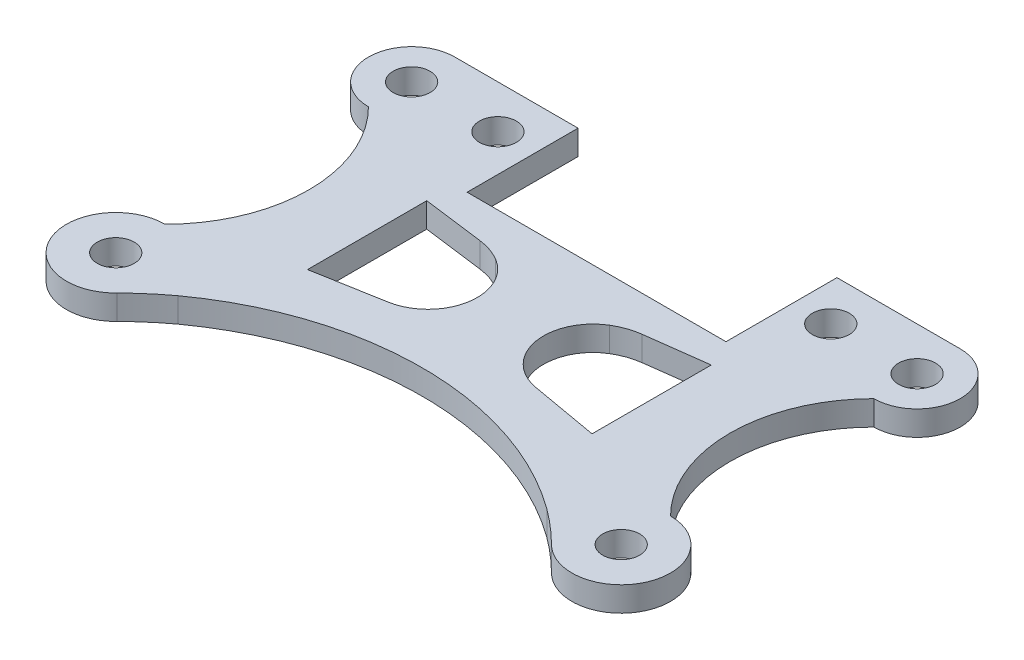
ISO-10303-21;
HEADER;
FILE_DESCRIPTION(('STEP AP214'),'2;1');
FILE_NAME('part.step','',(''),(''),'','','');
FILE_SCHEMA(('AUTOMOTIVE_DESIGN { 1 0 10303 214 1 1 1 1 }'));
ENDSEC;
DATA;
#1=APPLICATION_CONTEXT('core data for automotive mechanical design processes');
#2=APPLICATION_PROTOCOL_DEFINITION('international standard','automotive_design',2000,#1);
#3=PRODUCT_CONTEXT('',#1,'mechanical');
#4=PRODUCT('Part','Part','',(#3));
#5=PRODUCT_RELATED_PRODUCT_CATEGORY('part','',(#4));
#6=PRODUCT_DEFINITION_FORMATION('','',#4);
#7=PRODUCT_DEFINITION_CONTEXT('part definition',#1,'design');
#8=PRODUCT_DEFINITION('design','',#6,#7);
#9=PRODUCT_DEFINITION_SHAPE('','',#8);
#10=(LENGTH_UNIT() NAMED_UNIT(*) SI_UNIT(.MILLI.,.METRE.));
#11=(NAMED_UNIT(*) PLANE_ANGLE_UNIT() SI_UNIT($,.RADIAN.));
#12=(NAMED_UNIT(*) SI_UNIT($,.STERADIAN.) SOLID_ANGLE_UNIT());
#13=UNCERTAINTY_MEASURE_WITH_UNIT(LENGTH_MEASURE(1.E-05),#10,'distance_accuracy_value','');
#14=(GEOMETRIC_REPRESENTATION_CONTEXT(3) GLOBAL_UNCERTAINTY_ASSIGNED_CONTEXT((#13)) GLOBAL_UNIT_ASSIGNED_CONTEXT((#10,
#11,#12)) REPRESENTATION_CONTEXT('',''));
#15=CARTESIAN_POINT('',(0.,0.,0.));
#16=DIRECTION('',(0.,0.,1.));
#17=DIRECTION('',(1.,0.,0.));
#18=AXIS2_PLACEMENT_3D('',#15,#16,#17);
#19=CARTESIAN_POINT('',(0.,2.,0.));
#20=DIRECTION('',(0.,1.,0.));
#21=DIRECTION('',(0.,0.,1.));
#22=AXIS2_PLACEMENT_3D('',#19,#20,#21);
#23=PLANE('',#22);
#24=DIRECTION('',(0.,0.,-1.));
#25=VECTOR('',#24,1.);
#26=CARTESIAN_POINT('',(11.5396831908717,2.,2.59231264166946));
#27=LINE('',#26,#25);
#28=CARTESIAN_POINT('',(11.5396831908717,2.,6.90495336701713));
#29=VERTEX_POINT('',#28);
#30=CARTESIAN_POINT('',(11.5396831908717,2.,-2.76479575934835));
#31=VERTEX_POINT('',#30);
#32=EDGE_CURVE('E235',#29,#31,#27,.T.);
#33=ORIENTED_EDGE('',*,*,#32,.F.);
#34=DIRECTION('',(0.984711899791406,0.,0.174190913681512));
#35=VECTOR('',#34,1.);
#36=CARTESIAN_POINT('',(11.5396831908717,2.,6.90495336701713));
#37=LINE('',#36,#35);
#38=CARTESIAN_POINT('',(5.99237736878853,2.,5.92366100137787));
#39=VERTEX_POINT('',#38);
#40=EDGE_CURVE('E232',#39,#29,#37,.T.);
#41=ORIENTED_EDGE('',*,*,#40,.F.);
#42=CARTESIAN_POINT('',(6.68914102351458,2.,1.98481340221225));
#43=DIRECTION('',(0.,1.,0.));
#44=DIRECTION('',(0.,0.,1.));
#45=AXIS2_PLACEMENT_3D('',#42,#43,#44);
#46=CIRCLE('',#45,4.);
#47=CARTESIAN_POINT('',(4.61826863287689,2.,-1.43739166786969));
#48=VERTEX_POINT('',#47);
#49=EDGE_CURVE('E466',#39,#48,#46,.F.);
#50=ORIENTED_EDGE('',*,*,#49,.T.);
#51=CARTESIAN_POINT('',(7.206859121174,2.,2.84036466973273));
#52=DIRECTION('',(0.,1.,0.));
#53=DIRECTION('',(0.,0.,1.));
#54=AXIS2_PLACEMENT_3D('',#51,#52,#53);
#55=CIRCLE('',#54,5.);
#56=CARTESIAN_POINT('',(6.56245899551597,2.,-2.11793629713605));
#57=VERTEX_POINT('',#56);
#58=EDGE_CURVE('E452',#48,#57,#55,.F.);
#59=ORIENTED_EDGE('',*,*,#58,.T.);
#60=DIRECTION('',(-0.991660193373757,0.,0.128880025131607));
#61=VECTOR('',#60,1.);
#62=CARTESIAN_POINT('',(11.5396831908717,2.,-2.76479575934835));
#63=LINE('',#62,#61);
#64=EDGE_CURVE('E227',#31,#57,#63,.T.);
#65=ORIENTED_EDGE('',*,*,#64,.F.);
#66=EDGE_LOOP('',(#33,#41,#50,#59,#65));
#67=FACE_BOUND('',#66,.T.);
#68=CARTESIAN_POINT('',(0.,2.,34.6584329453217));
#69=DIRECTION('',(0.,1.,0.));
#70=DIRECTION('',(0.,0.,-1.));
#71=AXIS2_PLACEMENT_3D('',#68,#69,#70);
#72=CIRCLE('',#71,25.5094306586074);
#73=CARTESIAN_POINT('',(14.965299889075,2.,14.));
#74=VERTEX_POINT('',#73);
#75=CARTESIAN_POINT('',(-14.965299889075,2.,14.));
#76=VERTEX_POINT('',#75);
#77=EDGE_CURVE('E243',#74,#76,#72,.T.);
#78=ORIENTED_EDGE('',*,*,#77,.F.);
#79=CARTESIAN_POINT('',(0.,2.,34.1457513110777));
#80=DIRECTION('',(0.,1.,0.));
#81=DIRECTION('',(0.,0.,1.));
#82=AXIS2_PLACEMENT_3D('',#79,#80,#81);
#83=CIRCLE('',#82,25.0960454386291);
#84=CARTESIAN_POINT('',(17.6121605698455,2.,16.2677397684112));
#85=VERTEX_POINT('',#84);
#86=EDGE_CURVE('E251',#74,#85,#83,.F.);
#87=ORIENTED_EDGE('',*,*,#86,.T.);
#88=CARTESIAN_POINT('',(20.5,2.,13.5));
#89=DIRECTION('',(0.,1.,0.));
#90=DIRECTION('',(0.,0.,1.));
#91=AXIS2_PLACEMENT_3D('',#88,#89,#90);
#92=CIRCLE('',#91,4.);
#93=CARTESIAN_POINT('',(20.5,2.,9.50000000000001));
#94=VERTEX_POINT('',#93);
#95=EDGE_CURVE('E321',#85,#94,#92,.T.);
#96=ORIENTED_EDGE('',*,*,#95,.T.);
#97=CARTESIAN_POINT('',(28.75,2.,1.25));
#98=DIRECTION('',(0.,1.,0.));
#99=DIRECTION('',(0.,0.,-1.));
#100=AXIS2_PLACEMENT_3D('',#97,#98,#99);
#101=CIRCLE('',#100,11.6672618895781);
#102=CARTESIAN_POINT('',(20.5,2.,-7.));
#103=VERTEX_POINT('',#102);
#104=EDGE_CURVE('E308',#103,#94,#101,.T.);
#105=ORIENTED_EDGE('',*,*,#104,.F.);
#106=CARTESIAN_POINT('',(20.5,2.,-10.5));
#107=DIRECTION('',(0.,1.,0.));
#108=DIRECTION('',(0.,0.,1.));
#109=AXIS2_PLACEMENT_3D('',#106,#107,#108);
#110=CIRCLE('',#109,3.5);
#111=CARTESIAN_POINT('',(20.5,2.,-14.));
#112=VERTEX_POINT('',#111);
#113=EDGE_CURVE('E371',#103,#112,#110,.T.);
#114=ORIENTED_EDGE('',*,*,#113,.T.);
#115=DIRECTION('',(1.,0.,0.));
#116=VECTOR('',#115,1.);
#117=CARTESIAN_POINT('',(0.,2.,-14.));
#118=LINE('',#117,#116);
#119=CARTESIAN_POINT('',(10.5,2.,-14.));
#120=VERTEX_POINT('',#119);
#121=EDGE_CURVE('E374',#120,#112,#118,.T.);
#122=ORIENTED_EDGE('',*,*,#121,.F.);
#123=DIRECTION('',(0.,0.,1.));
#124=VECTOR('',#123,1.);
#125=CARTESIAN_POINT('',(10.5,2.,0.));
#126=LINE('',#125,#124);
#127=CARTESIAN_POINT('',(10.5,2.,-5.));
#128=VERTEX_POINT('',#127);
#129=EDGE_CURVE('E378',#120,#128,#126,.T.);
#130=ORIENTED_EDGE('',*,*,#129,.T.);
#131=DIRECTION('',(-1.,0.,0.));
#132=VECTOR('',#131,1.);
#133=CARTESIAN_POINT('',(0.,2.,-5.));
#134=LINE('',#133,#132);
#135=CARTESIAN_POINT('',(-10.5,2.,-4.99999999999999));
#136=VERTEX_POINT('',#135);
#137=EDGE_CURVE('E382',#128,#136,#134,.T.);
#138=ORIENTED_EDGE('',*,*,#137,.T.);
#139=DIRECTION('',(0.,0.,-1.));
#140=VECTOR('',#139,1.);
#141=CARTESIAN_POINT('',(-10.5,2.,0.));
#142=LINE('',#141,#140);
#143=CARTESIAN_POINT('',(-10.5,2.,-14.));
#144=VERTEX_POINT('',#143);
#145=EDGE_CURVE('E385',#136,#144,#142,.T.);
#146=ORIENTED_EDGE('',*,*,#145,.T.);
#147=CARTESIAN_POINT('',(-20.5,2.,-14.));
#148=VERTEX_POINT('',#147);
#149=EDGE_CURVE('E379',#148,#144,#118,.T.);
#150=ORIENTED_EDGE('',*,*,#149,.F.);
#151=CARTESIAN_POINT('',(-20.5,2.,-10.5));
#152=DIRECTION('',(0.,1.,0.));
#153=DIRECTION('',(0.,0.,1.));
#154=AXIS2_PLACEMENT_3D('',#151,#152,#153);
#155=CIRCLE('',#154,3.5);
#156=CARTESIAN_POINT('',(-20.5,2.,-7.));
#157=VERTEX_POINT('',#156);
#158=EDGE_CURVE('E347',#148,#157,#155,.T.);
#159=ORIENTED_EDGE('',*,*,#158,.T.);
#160=CARTESIAN_POINT('',(-28.75,2.,1.25));
#161=DIRECTION('',(0.,-1.,0.));
#162=DIRECTION('',(0.,0.,-1.));
#163=AXIS2_PLACEMENT_3D('',#160,#161,#162);
#164=CIRCLE('',#163,11.6672618895781);
#165=CARTESIAN_POINT('',(-20.5,2.,9.50000000000001));
#166=VERTEX_POINT('',#165);
#167=EDGE_CURVE('E279',#157,#166,#164,.T.);
#168=ORIENTED_EDGE('',*,*,#167,.T.);
#169=CARTESIAN_POINT('',(-20.5,2.,13.5));
#170=DIRECTION('',(0.,-1.,0.));
#171=DIRECTION('',(0.,0.,1.));
#172=AXIS2_PLACEMENT_3D('',#169,#170,#171);
#173=CIRCLE('',#172,4.);
#174=CARTESIAN_POINT('',(-17.6121605698453,2.,16.2677397684109));
#175=VERTEX_POINT('',#174);
#176=EDGE_CURVE('E295',#175,#166,#173,.T.);
#177=ORIENTED_EDGE('',*,*,#176,.F.);
#178=CARTESIAN_POINT('',(0.,2.,34.1457513110777));
#179=DIRECTION('',(0.,1.,0.));
#180=DIRECTION('',(0.,0.,1.));
#181=AXIS2_PLACEMENT_3D('',#178,#179,#180);
#182=CIRCLE('',#181,25.0960454386291);
#183=EDGE_CURVE('E264',#175,#76,#182,.F.);
#184=ORIENTED_EDGE('',*,*,#183,.T.);
#185=EDGE_LOOP('',(#78,#87,#96,#105,#114,#122,#130,#138,#146,#150,#159,#168,#177,#184));
#186=FACE_BOUND('',#185,.T.);
#187=CARTESIAN_POINT('',(-20.5,2.,13.5));
#188=DIRECTION('',(0.,-1.,0.));
#189=DIRECTION('',(0.,0.,1.));
#190=AXIS2_PLACEMENT_3D('',#187,#188,#189);
#191=CIRCLE('',#190,1.5);
#192=CARTESIAN_POINT('',(-20.5,2.,15.));
#193=VERTEX_POINT('',#192);
#194=EDGE_CURVE('E287',#193,#193,#191,.T.);
#195=ORIENTED_EDGE('',*,*,#194,.T.);
#196=EDGE_LOOP('',(#195));
#197=FACE_BOUND('',#196,.T.);
#198=CARTESIAN_POINT('',(20.5,2.,13.5));
#199=DIRECTION('',(0.,1.,0.));
#200=DIRECTION('',(0.,0.,1.));
#201=AXIS2_PLACEMENT_3D('',#198,#199,#200);
#202=CIRCLE('',#201,1.5);
#203=CARTESIAN_POINT('',(20.5,2.,15.));
#204=VERTEX_POINT('',#203);
#205=EDGE_CURVE('E313',#204,#204,#202,.T.);
#206=ORIENTED_EDGE('',*,*,#205,.F.);
#207=EDGE_LOOP('',(#206));
#208=FACE_BOUND('',#207,.T.);
#209=CARTESIAN_POINT('',(-13.5,2.,-10.5));
#210=DIRECTION('',(0.,1.,0.));
#211=DIRECTION('',(0.,0.,1.));
#212=AXIS2_PLACEMENT_3D('',#209,#210,#211);
#213=CIRCLE('',#212,1.5);
#214=CARTESIAN_POINT('',(-13.5,2.,-9.));
#215=VERTEX_POINT('',#214);
#216=EDGE_CURVE('E334',#215,#215,#213,.T.);
#217=ORIENTED_EDGE('',*,*,#216,.F.);
#218=EDGE_LOOP('',(#217));
#219=FACE_BOUND('',#218,.T.);
#220=CARTESIAN_POINT('',(-20.5,2.,-10.5));
#221=DIRECTION('',(0.,1.,0.));
#222=DIRECTION('',(0.,0.,1.));
#223=AXIS2_PLACEMENT_3D('',#220,#221,#222);
#224=CIRCLE('',#223,1.5);
#225=CARTESIAN_POINT('',(-20.5,2.,-9.));
#226=VERTEX_POINT('',#225);
#227=EDGE_CURVE('E339',#226,#226,#224,.T.);
#228=ORIENTED_EDGE('',*,*,#227,.F.);
#229=EDGE_LOOP('',(#228));
#230=FACE_BOUND('',#229,.T.);
#231=CARTESIAN_POINT('',(20.5,2.,-10.5));
#232=DIRECTION('',(0.,1.,0.));
#233=DIRECTION('',(0.,0.,1.));
#234=AXIS2_PLACEMENT_3D('',#231,#232,#233);
#235=CIRCLE('',#234,1.5);
#236=CARTESIAN_POINT('',(20.5,2.,-9.));
#237=VERTEX_POINT('',#236);
#238=EDGE_CURVE('E362',#237,#237,#235,.T.);
#239=ORIENTED_EDGE('',*,*,#238,.F.);
#240=EDGE_LOOP('',(#239));
#241=FACE_BOUND('',#240,.T.);
#242=CARTESIAN_POINT('',(13.5,2.,-10.5));
#243=DIRECTION('',(0.,1.,0.));
#244=DIRECTION('',(0.,0.,1.));
#245=AXIS2_PLACEMENT_3D('',#242,#243,#244);
#246=CIRCLE('',#245,1.5);
#247=CARTESIAN_POINT('',(13.5,2.,-9.));
#248=VERTEX_POINT('',#247);
#249=EDGE_CURVE('E366',#248,#248,#246,.T.);
#250=ORIENTED_EDGE('',*,*,#249,.F.);
#251=EDGE_LOOP('',(#250));
#252=FACE_BOUND('',#251,.T.);
#253=DIRECTION('',(0.,0.,-1.));
#254=VECTOR('',#253,1.);
#255=CARTESIAN_POINT('',(-11.5396831908717,2.,2.59231264166946));
#256=LINE('',#255,#254);
#257=CARTESIAN_POINT('',(-11.5396831908717,2.,6.90495336701713));
#258=VERTEX_POINT('',#257);
#259=CARTESIAN_POINT('',(-11.5396831908717,2.,-2.76479575934835));
#260=VERTEX_POINT('',#259);
#261=EDGE_CURVE('E205',#258,#260,#256,.T.);
#262=ORIENTED_EDGE('',*,*,#261,.T.);
#263=DIRECTION('',(0.991660193373757,0.,0.128880025131607));
#264=VECTOR('',#263,1.);
#265=CARTESIAN_POINT('',(-11.5396831908717,2.,-2.76479575934835));
#266=LINE('',#265,#264);
#267=CARTESIAN_POINT('',(-6.56245899551597,2.,-2.11793629713605));
#268=VERTEX_POINT('',#267);
#269=EDGE_CURVE('E207',#260,#268,#266,.T.);
#270=ORIENTED_EDGE('',*,*,#269,.T.);
#271=CARTESIAN_POINT('',(-7.206859121174,2.,2.84036466973273));
#272=DIRECTION('',(0.,1.,0.));
#273=DIRECTION('',(0.,0.,1.));
#274=AXIS2_PLACEMENT_3D('',#271,#272,#273);
#275=CIRCLE('',#274,5.);
#276=CARTESIAN_POINT('',(-4.61826863287689,2.,-1.43739166786969));
#277=VERTEX_POINT('',#276);
#278=EDGE_CURVE('E485',#268,#277,#275,.F.);
#279=ORIENTED_EDGE('',*,*,#278,.T.);
#280=CARTESIAN_POINT('',(-6.68914102351458,2.,1.98481340221225));
#281=DIRECTION('',(0.,1.,0.));
#282=DIRECTION('',(0.,0.,1.));
#283=AXIS2_PLACEMENT_3D('',#280,#281,#282);
#284=CIRCLE('',#283,4.);
#285=CARTESIAN_POINT('',(-5.99237736878853,2.,5.92366100137787));
#286=VERTEX_POINT('',#285);
#287=EDGE_CURVE('E52',#277,#286,#284,.F.);
#288=ORIENTED_EDGE('',*,*,#287,.T.);
#289=DIRECTION('',(-0.984711899791406,0.,0.174190913681512));
#290=VECTOR('',#289,1.);
#291=CARTESIAN_POINT('',(-11.5396831908717,2.,6.90495336701713));
#292=LINE('',#291,#290);
#293=EDGE_CURVE('E201',#286,#258,#292,.T.);
#294=ORIENTED_EDGE('',*,*,#293,.T.);
#295=EDGE_LOOP('',(#262,#270,#279,#288,#294));
#296=FACE_BOUND('',#295,.T.);
#297=ADVANCED_FACE('F43',(#67,#186,#197,#208,#219,#230,#241,#252,#296),#23,.T.);
#298=CARTESIAN_POINT('',(0.,0.,0.));
#299=DIRECTION('',(0.,1.,0.));
#300=DIRECTION('',(0.,0.,1.));
#301=AXIS2_PLACEMENT_3D('',#298,#299,#300);
#302=PLANE('',#301);
#303=CARTESIAN_POINT('',(-20.5,0.,13.5));
#304=DIRECTION('',(0.,-1.,0.));
#305=DIRECTION('',(0.,0.,1.));
#306=AXIS2_PLACEMENT_3D('',#303,#304,#305);
#307=CIRCLE('',#306,1.5);
#308=CARTESIAN_POINT('',(-20.5,0.,15.));
#309=VERTEX_POINT('',#308);
#310=EDGE_CURVE('E291',#309,#309,#307,.T.);
#311=ORIENTED_EDGE('',*,*,#310,.F.);
#312=EDGE_LOOP('',(#311));
#313=FACE_BOUND('',#312,.T.);
#314=CARTESIAN_POINT('',(20.5,0.,13.5));
#315=DIRECTION('',(0.,1.,0.));
#316=DIRECTION('',(0.,0.,1.));
#317=AXIS2_PLACEMENT_3D('',#314,#315,#316);
#318=CIRCLE('',#317,1.5);
#319=CARTESIAN_POINT('',(20.5,0.,15.));
#320=VERTEX_POINT('',#319);
#321=EDGE_CURVE('E317',#320,#320,#318,.T.);
#322=ORIENTED_EDGE('',*,*,#321,.T.);
#323=EDGE_LOOP('',(#322));
#324=FACE_BOUND('',#323,.T.);
#325=CARTESIAN_POINT('',(-13.5,0.,-10.5));
#326=DIRECTION('',(0.,1.,0.));
#327=DIRECTION('',(0.,0.,1.));
#328=AXIS2_PLACEMENT_3D('',#325,#326,#327);
#329=CIRCLE('',#328,1.5);
#330=CARTESIAN_POINT('',(-13.5,0.,-9.));
#331=VERTEX_POINT('',#330);
#332=EDGE_CURVE('E335',#331,#331,#329,.T.);
#333=ORIENTED_EDGE('',*,*,#332,.T.);
#334=EDGE_LOOP('',(#333));
#335=FACE_BOUND('',#334,.T.);
#336=CARTESIAN_POINT('',(-20.5,0.,-10.5));
#337=DIRECTION('',(0.,1.,0.));
#338=DIRECTION('',(0.,0.,1.));
#339=AXIS2_PLACEMENT_3D('',#336,#337,#338);
#340=CIRCLE('',#339,1.5);
#341=CARTESIAN_POINT('',(-20.5,0.,-9.));
#342=VERTEX_POINT('',#341);
#343=EDGE_CURVE('E343',#342,#342,#340,.T.);
#344=ORIENTED_EDGE('',*,*,#343,.T.);
#345=EDGE_LOOP('',(#344));
#346=FACE_BOUND('',#345,.T.);
#347=CARTESIAN_POINT('',(20.5,0.,-10.5));
#348=DIRECTION('',(0.,1.,0.));
#349=DIRECTION('',(0.,0.,1.));
#350=AXIS2_PLACEMENT_3D('',#347,#348,#349);
#351=CIRCLE('',#350,1.5);
#352=CARTESIAN_POINT('',(20.5,0.,-9.));
#353=VERTEX_POINT('',#352);
#354=EDGE_CURVE('E361',#353,#353,#351,.T.);
#355=ORIENTED_EDGE('',*,*,#354,.T.);
#356=EDGE_LOOP('',(#355));
#357=FACE_BOUND('',#356,.T.);
#358=CARTESIAN_POINT('',(13.5,0.,-10.5));
#359=DIRECTION('',(0.,1.,0.));
#360=DIRECTION('',(0.,0.,1.));
#361=AXIS2_PLACEMENT_3D('',#358,#359,#360);
#362=CIRCLE('',#361,1.5);
#363=CARTESIAN_POINT('',(13.5,0.,-9.));
#364=VERTEX_POINT('',#363);
#365=EDGE_CURVE('E391',#364,#364,#362,.T.);
#366=ORIENTED_EDGE('',*,*,#365,.T.);
#367=EDGE_LOOP('',(#366));
#368=FACE_BOUND('',#367,.T.);
#369=CARTESIAN_POINT('',(0.,0.,34.1457513110777));
#370=DIRECTION('',(0.,1.,0.));
#371=DIRECTION('',(0.,0.,1.));
#372=AXIS2_PLACEMENT_3D('',#369,#370,#371);
#373=CIRCLE('',#372,25.0960454386291);
#374=CARTESIAN_POINT('',(14.965299889075,0.,14.));
#375=VERTEX_POINT('',#374);
#376=CARTESIAN_POINT('',(17.6121605698455,0.,16.2677397684112));
#377=VERTEX_POINT('',#376);
#378=EDGE_CURVE('E254',#375,#377,#373,.F.);
#379=ORIENTED_EDGE('',*,*,#378,.F.);
#380=CARTESIAN_POINT('',(0.,0.,34.6584329453217));
#381=DIRECTION('',(0.,1.,0.));
#382=DIRECTION('',(0.,0.,-1.));
#383=AXIS2_PLACEMENT_3D('',#380,#381,#382);
#384=CIRCLE('',#383,25.5094306586074);
#385=CARTESIAN_POINT('',(-14.965299889075,0.,14.));
#386=VERTEX_POINT('',#385);
#387=EDGE_CURVE('E247',#375,#386,#384,.T.);
#388=ORIENTED_EDGE('',*,*,#387,.T.);
#389=CARTESIAN_POINT('',(0.,0.,34.1457513110777));
#390=DIRECTION('',(0.,1.,0.));
#391=DIRECTION('',(0.,0.,1.));
#392=AXIS2_PLACEMENT_3D('',#389,#390,#391);
#393=CIRCLE('',#392,25.0960454386291);
#394=CARTESIAN_POINT('',(-17.6121605698453,0.,16.2677397684109));
#395=VERTEX_POINT('',#394);
#396=EDGE_CURVE('E267',#395,#386,#393,.F.);
#397=ORIENTED_EDGE('',*,*,#396,.F.);
#398=CARTESIAN_POINT('',(-20.5,0.,13.5));
#399=DIRECTION('',(0.,-1.,0.));
#400=DIRECTION('',(0.,0.,1.));
#401=AXIS2_PLACEMENT_3D('',#398,#399,#400);
#402=CIRCLE('',#401,4.);
#403=CARTESIAN_POINT('',(-20.5,0.,9.50000000000001));
#404=VERTEX_POINT('',#403);
#405=EDGE_CURVE('E299',#395,#404,#402,.T.);
#406=ORIENTED_EDGE('',*,*,#405,.T.);
#407=CARTESIAN_POINT('',(-28.75,0.,1.25));
#408=DIRECTION('',(0.,-1.,0.));
#409=DIRECTION('',(0.,0.,-1.));
#410=AXIS2_PLACEMENT_3D('',#407,#408,#409);
#411=CIRCLE('',#410,11.6672618895781);
#412=CARTESIAN_POINT('',(-20.5,0.,-7.));
#413=VERTEX_POINT('',#412);
#414=EDGE_CURVE('E283',#413,#404,#411,.T.);
#415=ORIENTED_EDGE('',*,*,#414,.F.);
#416=CARTESIAN_POINT('',(-20.5,0.,-10.5));
#417=DIRECTION('',(0.,1.,0.));
#418=DIRECTION('',(0.,0.,1.));
#419=AXIS2_PLACEMENT_3D('',#416,#417,#418);
#420=CIRCLE('',#419,3.5);
#421=CARTESIAN_POINT('',(-20.5,0.,-14.));
#422=VERTEX_POINT('',#421);
#423=EDGE_CURVE('E351',#422,#413,#420,.T.);
#424=ORIENTED_EDGE('',*,*,#423,.F.);
#425=DIRECTION('',(1.,0.,0.));
#426=VECTOR('',#425,1.);
#427=CARTESIAN_POINT('',(0.,0.,-14.));
#428=LINE('',#427,#426);
#429=CARTESIAN_POINT('',(-10.5,0.,-14.));
#430=VERTEX_POINT('',#429);
#431=EDGE_CURVE('E367',#422,#430,#428,.T.);
#432=ORIENTED_EDGE('',*,*,#431,.T.);
#433=DIRECTION('',(0.,0.,-1.));
#434=VECTOR('',#433,1.);
#435=CARTESIAN_POINT('',(-10.5,0.,0.));
#436=LINE('',#435,#434);
#437=CARTESIAN_POINT('',(-10.5,0.,-4.99999999999999));
#438=VERTEX_POINT('',#437);
#439=EDGE_CURVE('E409',#438,#430,#436,.T.);
#440=ORIENTED_EDGE('',*,*,#439,.F.);
#441=DIRECTION('',(-1.,0.,0.));
#442=VECTOR('',#441,1.);
#443=CARTESIAN_POINT('',(0.,0.,-5.));
#444=LINE('',#443,#442);
#445=CARTESIAN_POINT('',(10.5,0.,-5.));
#446=VERTEX_POINT('',#445);
#447=EDGE_CURVE('E406',#446,#438,#444,.T.);
#448=ORIENTED_EDGE('',*,*,#447,.F.);
#449=DIRECTION('',(0.,0.,1.));
#450=VECTOR('',#449,1.);
#451=CARTESIAN_POINT('',(10.5,0.,0.));
#452=LINE('',#451,#450);
#453=CARTESIAN_POINT('',(10.5,0.,-14.));
#454=VERTEX_POINT('',#453);
#455=EDGE_CURVE('E403',#454,#446,#452,.T.);
#456=ORIENTED_EDGE('',*,*,#455,.F.);
#457=CARTESIAN_POINT('',(20.5,0.,-14.));
#458=VERTEX_POINT('',#457);
#459=EDGE_CURVE('E399',#454,#458,#428,.T.);
#460=ORIENTED_EDGE('',*,*,#459,.T.);
#461=CARTESIAN_POINT('',(20.5,0.,-10.5));
#462=DIRECTION('',(0.,1.,0.));
#463=DIRECTION('',(0.,0.,1.));
#464=AXIS2_PLACEMENT_3D('',#461,#462,#463);
#465=CIRCLE('',#464,3.5);
#466=CARTESIAN_POINT('',(20.5,0.,-7.));
#467=VERTEX_POINT('',#466);
#468=EDGE_CURVE('E395',#467,#458,#465,.T.);
#469=ORIENTED_EDGE('',*,*,#468,.F.);
#470=CARTESIAN_POINT('',(28.75,0.,1.25));
#471=DIRECTION('',(0.,1.,0.));
#472=DIRECTION('',(0.,0.,-1.));
#473=AXIS2_PLACEMENT_3D('',#470,#471,#472);
#474=CIRCLE('',#473,11.6672618895781);
#475=CARTESIAN_POINT('',(20.5,0.,9.50000000000001));
#476=VERTEX_POINT('',#475);
#477=EDGE_CURVE('E309',#467,#476,#474,.T.);
#478=ORIENTED_EDGE('',*,*,#477,.T.);
#479=CARTESIAN_POINT('',(20.5,0.,13.5));
#480=DIRECTION('',(0.,1.,0.));
#481=DIRECTION('',(0.,0.,1.));
#482=AXIS2_PLACEMENT_3D('',#479,#480,#481);
#483=CIRCLE('',#482,4.);
#484=EDGE_CURVE('E325',#377,#476,#483,.T.);
#485=ORIENTED_EDGE('',*,*,#484,.F.);
#486=EDGE_LOOP('',(#379,#388,#397,#406,#415,#424,#432,#440,#448,#456,#460,#469,#478,#485));
#487=FACE_BOUND('',#486,.T.);
#488=CARTESIAN_POINT('',(7.206859121174,0.,2.84036466973273));
#489=DIRECTION('',(0.,1.,0.));
#490=DIRECTION('',(0.,0.,1.));
#491=AXIS2_PLACEMENT_3D('',#488,#489,#490);
#492=CIRCLE('',#491,5.);
#493=CARTESIAN_POINT('',(6.56245899551597,0.,-2.11793629713605));
#494=VERTEX_POINT('',#493);
#495=CARTESIAN_POINT('',(4.61826863287689,0.,-1.43739166786969));
#496=VERTEX_POINT('',#495);
#497=EDGE_CURVE('E455',#494,#496,#492,.T.);
#498=ORIENTED_EDGE('',*,*,#497,.T.);
#499=CARTESIAN_POINT('',(6.68914102351458,0.,1.98481340221225));
#500=DIRECTION('',(0.,1.,0.));
#501=DIRECTION('',(0.,0.,1.));
#502=AXIS2_PLACEMENT_3D('',#499,#500,#501);
#503=CIRCLE('',#502,4.);
#504=CARTESIAN_POINT('',(5.99237736878853,0.,5.92366100137787));
#505=VERTEX_POINT('',#504);
#506=EDGE_CURVE('E469',#496,#505,#503,.T.);
#507=ORIENTED_EDGE('',*,*,#506,.T.);
#508=DIRECTION('',(0.984711899791406,0.,0.174190913681512));
#509=VECTOR('',#508,1.);
#510=CARTESIAN_POINT('',(-0.83424937077266,0.,4.71606276946993));
#511=LINE('',#510,#509);
#512=CARTESIAN_POINT('',(11.5396831908717,0.,6.90495336701713));
#513=VERTEX_POINT('',#512);
#514=EDGE_CURVE('E442',#505,#513,#511,.T.);
#515=ORIENTED_EDGE('',*,*,#514,.T.);
#516=DIRECTION('',(0.,0.,-1.));
#517=VECTOR('',#516,1.);
#518=CARTESIAN_POINT('',(11.5396831908717,0.,0.));
#519=LINE('',#518,#517);
#520=CARTESIAN_POINT('',(11.5396831908717,0.,-2.76479575934835));
#521=VERTEX_POINT('',#520);
#522=EDGE_CURVE('E445',#513,#521,#519,.T.);
#523=ORIENTED_EDGE('',*,*,#522,.T.);
#524=DIRECTION('',(-0.991660193373757,0.,0.128880025131607));
#525=VECTOR('',#524,1.);
#526=CARTESIAN_POINT('',(-0.161680408802974,0.,-1.24404092328955));
#527=LINE('',#526,#525);
#528=EDGE_CURVE('E438',#521,#494,#527,.T.);
#529=ORIENTED_EDGE('',*,*,#528,.T.);
#530=EDGE_LOOP('',(#498,#507,#515,#523,#529));
#531=FACE_BOUND('',#530,.T.);
#532=DIRECTION('',(0.991660193373757,0.,0.128880025131607));
#533=VECTOR('',#532,1.);
#534=CARTESIAN_POINT('',(0.161680408802974,0.,-1.24404092328955));
#535=LINE('',#534,#533);
#536=CARTESIAN_POINT('',(-11.5396831908717,0.,-2.76479575934835));
#537=VERTEX_POINT('',#536);
#538=CARTESIAN_POINT('',(-6.56245899551597,0.,-2.11793629713605));
#539=VERTEX_POINT('',#538);
#540=EDGE_CURVE('E477',#537,#539,#535,.T.);
#541=ORIENTED_EDGE('',*,*,#540,.F.);
#542=DIRECTION('',(0.,0.,-1.));
#543=VECTOR('',#542,1.);
#544=CARTESIAN_POINT('',(-11.5396831908717,0.,0.));
#545=LINE('',#544,#543);
#546=CARTESIAN_POINT('',(-11.5396831908717,0.,6.90495336701713));
#547=VERTEX_POINT('',#546);
#548=EDGE_CURVE('E472',#547,#537,#545,.T.);
#549=ORIENTED_EDGE('',*,*,#548,.F.);
#550=DIRECTION('',(-0.984711899791406,0.,0.174190913681512));
#551=VECTOR('',#550,1.);
#552=CARTESIAN_POINT('',(0.83424937077266,0.,4.71606276946993));
#553=LINE('',#552,#551);
#554=CARTESIAN_POINT('',(-5.99237736878853,0.,5.92366100137787));
#555=VERTEX_POINT('',#554);
#556=EDGE_CURVE('E212',#555,#547,#553,.T.);
#557=ORIENTED_EDGE('',*,*,#556,.F.);
#558=CARTESIAN_POINT('',(-6.68914102351458,0.,1.98481340221225));
#559=DIRECTION('',(0.,1.,0.));
#560=DIRECTION('',(0.,0.,1.));
#561=AXIS2_PLACEMENT_3D('',#558,#559,#560);
#562=CIRCLE('',#561,4.);
#563=CARTESIAN_POINT('',(-4.61826863287689,0.,-1.43739166786969));
#564=VERTEX_POINT('',#563);
#565=EDGE_CURVE('E11',#555,#564,#562,.T.);
#566=ORIENTED_EDGE('',*,*,#565,.T.);
#567=CARTESIAN_POINT('',(-7.206859121174,0.,2.84036466973273));
#568=DIRECTION('',(0.,1.,0.));
#569=DIRECTION('',(0.,0.,1.));
#570=AXIS2_PLACEMENT_3D('',#567,#568,#569);
#571=CIRCLE('',#570,5.);
#572=EDGE_CURVE('E488',#564,#539,#571,.T.);
#573=ORIENTED_EDGE('',*,*,#572,.T.);
#574=EDGE_LOOP('',(#541,#549,#557,#566,#573));
#575=FACE_BOUND('',#574,.T.);
#576=ADVANCED_FACE('F505',(#313,#324,#335,#346,#357,#368,#487,#531,#575),#302,.F.);
#577=CARTESIAN_POINT('',(20.5,2.,-10.5));
#578=DIRECTION('',(0.,-1.,0.));
#579=DIRECTION('',(0.,0.,-1.));
#580=AXIS2_PLACEMENT_3D('',#577,#578,#579);
#581=CYLINDRICAL_SURFACE('',#580,3.5);
#582=ORIENTED_EDGE('',*,*,#468,.T.);
#583=DIRECTION('',(0.,-1.,0.));
#584=VECTOR('',#583,1.);
#585=CARTESIAN_POINT('',(20.5,2.,-14.));
#586=LINE('',#585,#584);
#587=EDGE_CURVE('E431',#112,#458,#586,.T.);
#588=ORIENTED_EDGE('',*,*,#587,.F.);
#589=ORIENTED_EDGE('',*,*,#113,.F.);
#590=DIRECTION('',(0.,-1.,0.));
#591=VECTOR('',#590,1.);
#592=CARTESIAN_POINT('',(20.5,2.,-7.));
#593=LINE('',#592,#591);
#594=EDGE_CURVE('E434',#103,#467,#593,.T.);
#595=ORIENTED_EDGE('',*,*,#594,.T.);
#596=EDGE_LOOP('',(#582,#588,#589,#595));
#597=FACE_BOUND('',#596,.T.);
#598=ADVANCED_FACE('F539',(#597),#581,.T.);
#599=CARTESIAN_POINT('',(0.,2.,-14.));
#600=DIRECTION('',(0.,0.,-1.));
#601=DIRECTION('',(-1.,0.,0.));
#602=AXIS2_PLACEMENT_3D('',#599,#600,#601);
#603=PLANE('',#602);
#604=ORIENTED_EDGE('',*,*,#459,.F.);
#605=DIRECTION('',(0.,-1.,0.));
#606=VECTOR('',#605,1.);
#607=CARTESIAN_POINT('',(10.5,2.,-14.));
#608=LINE('',#607,#606);
#609=EDGE_CURVE('E428',#120,#454,#608,.T.);
#610=ORIENTED_EDGE('',*,*,#609,.F.);
#611=ORIENTED_EDGE('',*,*,#121,.T.);
#612=ORIENTED_EDGE('',*,*,#587,.T.);
#613=EDGE_LOOP('',(#604,#610,#611,#612));
#614=FACE_BOUND('',#613,.T.);
#615=ADVANCED_FACE('F533',(#614),#603,.T.);
#616=CARTESIAN_POINT('',(10.5,2.,0.));
#617=DIRECTION('',(1.,0.,0.));
#618=DIRECTION('',(0.,0.,-1.));
#619=AXIS2_PLACEMENT_3D('',#616,#617,#618);
#620=PLANE('',#619);
#621=ORIENTED_EDGE('',*,*,#455,.T.);
#622=DIRECTION('',(0.,-1.,0.));
#623=VECTOR('',#622,1.);
#624=CARTESIAN_POINT('',(10.5,2.,-5.));
#625=LINE('',#624,#623);
#626=EDGE_CURVE('E424',#128,#446,#625,.T.);
#627=ORIENTED_EDGE('',*,*,#626,.F.);
#628=ORIENTED_EDGE('',*,*,#129,.F.);
#629=ORIENTED_EDGE('',*,*,#609,.T.);
#630=EDGE_LOOP('',(#621,#627,#628,#629));
#631=FACE_BOUND('',#630,.T.);
#632=ADVANCED_FACE('F594',(#631),#620,.F.);
#633=CARTESIAN_POINT('',(0.,2.,-5.));
#634=DIRECTION('',(0.,0.,1.));
#635=DIRECTION('',(1.,0.,0.));
#636=AXIS2_PLACEMENT_3D('',#633,#634,#635);
#637=PLANE('',#636);
#638=ORIENTED_EDGE('',*,*,#447,.T.);
#639=DIRECTION('',(0.,-1.,0.));
#640=VECTOR('',#639,1.);
#641=CARTESIAN_POINT('',(-10.5,2.,-4.99999999999999));
#642=LINE('',#641,#640);
#643=EDGE_CURVE('E420',#136,#438,#642,.T.);
#644=ORIENTED_EDGE('',*,*,#643,.F.);
#645=ORIENTED_EDGE('',*,*,#137,.F.);
#646=ORIENTED_EDGE('',*,*,#626,.T.);
#647=EDGE_LOOP('',(#638,#644,#645,#646));
#648=FACE_BOUND('',#647,.T.);
#649=ADVANCED_FACE('F526',(#648),#637,.F.);
#650=CARTESIAN_POINT('',(-10.5,2.,0.));
#651=DIRECTION('',(-1.,0.,0.));
#652=DIRECTION('',(0.,0.,1.));
#653=AXIS2_PLACEMENT_3D('',#650,#651,#652);
#654=PLANE('',#653);
#655=ORIENTED_EDGE('',*,*,#439,.T.);
#656=DIRECTION('',(0.,-1.,0.));
#657=VECTOR('',#656,1.);
#658=CARTESIAN_POINT('',(-10.5,2.,-14.));
#659=LINE('',#658,#657);
#660=EDGE_CURVE('E417',#144,#430,#659,.T.);
#661=ORIENTED_EDGE('',*,*,#660,.F.);
#662=ORIENTED_EDGE('',*,*,#145,.F.);
#663=ORIENTED_EDGE('',*,*,#643,.T.);
#664=EDGE_LOOP('',(#655,#661,#662,#663));
#665=FACE_BOUND('',#664,.T.);
#666=ADVANCED_FACE('F524',(#665),#654,.F.);
#667=CARTESIAN_POINT('',(13.5,2.,-10.5));
#668=DIRECTION('',(0.,-1.,0.));
#669=DIRECTION('',(0.,0.,-1.));
#670=AXIS2_PLACEMENT_3D('',#667,#668,#669);
#671=CYLINDRICAL_SURFACE('',#670,1.5);
#672=ORIENTED_EDGE('',*,*,#249,.T.);
#673=EDGE_LOOP('',(#672));
#674=FACE_BOUND('',#673,.T.);
#675=ORIENTED_EDGE('',*,*,#365,.F.);
#676=EDGE_LOOP('',(#675));
#677=FACE_BOUND('',#676,.T.);
#678=ADVANCED_FACE('F591',(#674,#677),#671,.F.);
#679=CARTESIAN_POINT('',(20.5,2.,-10.5));
#680=DIRECTION('',(0.,-1.,0.));
#681=DIRECTION('',(0.,0.,-1.));
#682=AXIS2_PLACEMENT_3D('',#679,#680,#681);
#683=CYLINDRICAL_SURFACE('',#682,1.5);
#684=ORIENTED_EDGE('',*,*,#238,.T.);
#685=EDGE_LOOP('',(#684));
#686=FACE_BOUND('',#685,.T.);
#687=ORIENTED_EDGE('',*,*,#354,.F.);
#688=EDGE_LOOP('',(#687));
#689=FACE_BOUND('',#688,.T.);
#690=ADVANCED_FACE('F588',(#686,#689),#683,.F.);
#691=ORIENTED_EDGE('',*,*,#431,.F.);
#692=DIRECTION('',(0.,-1.,0.));
#693=VECTOR('',#692,1.);
#694=CARTESIAN_POINT('',(-20.5,2.,-14.));
#695=LINE('',#694,#693);
#696=EDGE_CURVE('E413',#148,#422,#695,.T.);
#697=ORIENTED_EDGE('',*,*,#696,.F.);
#698=ORIENTED_EDGE('',*,*,#149,.T.);
#699=ORIENTED_EDGE('',*,*,#660,.T.);
#700=EDGE_LOOP('',(#691,#697,#698,#699));
#701=FACE_BOUND('',#700,.T.);
#702=ADVANCED_FACE('F510',(#701),#603,.T.);
#703=CARTESIAN_POINT('',(-20.5,0.,-10.5));
#704=DIRECTION('',(0.,1.,0.));
#705=DIRECTION('',(0.,0.,1.));
#706=AXIS2_PLACEMENT_3D('',#703,#704,#705);
#707=CYLINDRICAL_SURFACE('',#706,3.5);
#708=DIRECTION('',(0.,1.,0.));
#709=VECTOR('',#708,1.);
#710=CARTESIAN_POINT('',(-20.5,0.,-7.));
#711=LINE('',#710,#709);
#712=EDGE_CURVE('E355',#157,#413,#711,.F.);
#713=ORIENTED_EDGE('',*,*,#712,.F.);
#714=ORIENTED_EDGE('',*,*,#158,.F.);
#715=ORIENTED_EDGE('',*,*,#696,.T.);
#716=ORIENTED_EDGE('',*,*,#423,.T.);
#717=EDGE_LOOP('',(#713,#714,#715,#716));
#718=FACE_BOUND('',#717,.T.);
#719=ADVANCED_FACE('F516',(#718),#707,.T.);
#720=CARTESIAN_POINT('',(-20.5,0.,-10.5));
#721=DIRECTION('',(0.,1.,0.));
#722=DIRECTION('',(0.,0.,1.));
#723=AXIS2_PLACEMENT_3D('',#720,#721,#722);
#724=CYLINDRICAL_SURFACE('',#723,1.5);
#725=ORIENTED_EDGE('',*,*,#343,.F.);
#726=EDGE_LOOP('',(#725));
#727=FACE_BOUND('',#726,.T.);
#728=ORIENTED_EDGE('',*,*,#227,.T.);
#729=EDGE_LOOP('',(#728));
#730=FACE_BOUND('',#729,.T.);
#731=ADVANCED_FACE('F767',(#727,#730),#724,.F.);
#732=CARTESIAN_POINT('',(-13.5,0.,-10.5));
#733=DIRECTION('',(0.,1.,0.));
#734=DIRECTION('',(0.,0.,1.));
#735=AXIS2_PLACEMENT_3D('',#732,#733,#734);
#736=CYLINDRICAL_SURFACE('',#735,1.5);
#737=ORIENTED_EDGE('',*,*,#332,.F.);
#738=EDGE_LOOP('',(#737));
#739=FACE_BOUND('',#738,.T.);
#740=ORIENTED_EDGE('',*,*,#216,.T.);
#741=EDGE_LOOP('',(#740));
#742=FACE_BOUND('',#741,.T.);
#743=ADVANCED_FACE('F773',(#739,#742),#736,.F.);
#744=CARTESIAN_POINT('',(20.5,0.,13.5));
#745=DIRECTION('',(0.,1.,0.));
#746=DIRECTION('',(0.,0.,1.));
#747=AXIS2_PLACEMENT_3D('',#744,#745,#746);
#748=CYLINDRICAL_SURFACE('',#747,4.);
#749=DIRECTION('',(0.,1.,0.));
#750=VECTOR('',#749,1.);
#751=CARTESIAN_POINT('',(17.6121605698455,0.,16.2677397684112));
#752=LINE('',#751,#750);
#753=EDGE_CURVE('E260',#377,#85,#752,.T.);
#754=ORIENTED_EDGE('',*,*,#753,.F.);
#755=ORIENTED_EDGE('',*,*,#484,.T.);
#756=DIRECTION('',(0.,1.,0.));
#757=VECTOR('',#756,1.);
#758=CARTESIAN_POINT('',(20.5,0.,9.50000000000001));
#759=LINE('',#758,#757);
#760=EDGE_CURVE('E328',#476,#94,#759,.T.);
#761=ORIENTED_EDGE('',*,*,#760,.T.);
#762=ORIENTED_EDGE('',*,*,#95,.F.);
#763=EDGE_LOOP('',(#754,#755,#761,#762));
#764=FACE_BOUND('',#763,.T.);
#765=ADVANCED_FACE('F548',(#764),#748,.T.);
#766=CARTESIAN_POINT('',(20.5,0.,13.5));
#767=DIRECTION('',(0.,1.,0.));
#768=DIRECTION('',(0.,0.,1.));
#769=AXIS2_PLACEMENT_3D('',#766,#767,#768);
#770=CYLINDRICAL_SURFACE('',#769,1.5);
#771=ORIENTED_EDGE('',*,*,#321,.F.);
#772=EDGE_LOOP('',(#771));
#773=FACE_BOUND('',#772,.T.);
#774=ORIENTED_EDGE('',*,*,#205,.T.);
#775=EDGE_LOOP('',(#774));
#776=FACE_BOUND('',#775,.T.);
#777=ADVANCED_FACE('F787',(#773,#776),#770,.F.);
#778=CARTESIAN_POINT('',(28.75,0.,1.25));
#779=DIRECTION('',(0.,1.,0.));
#780=DIRECTION('',(0.,0.,1.));
#781=AXIS2_PLACEMENT_3D('',#778,#779,#780);
#782=CYLINDRICAL_SURFACE('',#781,11.6672618895781);
#783=ORIENTED_EDGE('',*,*,#104,.T.);
#784=ORIENTED_EDGE('',*,*,#760,.F.);
#785=ORIENTED_EDGE('',*,*,#477,.F.);
#786=ORIENTED_EDGE('',*,*,#594,.F.);
#787=EDGE_LOOP('',(#783,#784,#785,#786));
#788=FACE_BOUND('',#787,.T.);
#789=ADVANCED_FACE('F543',(#788),#782,.F.);
#790=CARTESIAN_POINT('',(-20.5,0.,13.5));
#791=DIRECTION('',(0.,1.,0.));
#792=DIRECTION('',(0.,0.,1.));
#793=AXIS2_PLACEMENT_3D('',#790,#791,#792);
#794=CYLINDRICAL_SURFACE('',#793,4.);
#795=ORIENTED_EDGE('',*,*,#405,.F.);
#796=DIRECTION('',(0.,1.,0.));
#797=VECTOR('',#796,1.);
#798=CARTESIAN_POINT('',(-17.6121605698453,0.,16.2677397684109));
#799=LINE('',#798,#797);
#800=EDGE_CURVE('E271',#395,#175,#799,.T.);
#801=ORIENTED_EDGE('',*,*,#800,.T.);
#802=ORIENTED_EDGE('',*,*,#176,.T.);
#803=DIRECTION('',(0.,1.,0.));
#804=VECTOR('',#803,1.);
#805=CARTESIAN_POINT('',(-20.5,0.,9.50000000000001));
#806=LINE('',#805,#804);
#807=EDGE_CURVE('E302',#166,#404,#806,.F.);
#808=ORIENTED_EDGE('',*,*,#807,.T.);
#809=EDGE_LOOP('',(#795,#801,#802,#808));
#810=FACE_BOUND('',#809,.T.);
#811=ADVANCED_FACE('F560',(#810),#794,.T.);
#812=CARTESIAN_POINT('',(-20.5,0.,13.5));
#813=DIRECTION('',(0.,1.,0.));
#814=DIRECTION('',(0.,0.,1.));
#815=AXIS2_PLACEMENT_3D('',#812,#813,#814);
#816=CYLINDRICAL_SURFACE('',#815,1.5);
#817=ORIENTED_EDGE('',*,*,#310,.T.);
#818=EDGE_LOOP('',(#817));
#819=FACE_BOUND('',#818,.T.);
#820=ORIENTED_EDGE('',*,*,#194,.F.);
#821=EDGE_LOOP('',(#820));
#822=FACE_BOUND('',#821,.T.);
#823=ADVANCED_FACE('F565',(#819,#822),#816,.F.);
#824=CARTESIAN_POINT('',(-28.75,0.,1.25));
#825=DIRECTION('',(0.,1.,0.));
#826=DIRECTION('',(0.,0.,1.));
#827=AXIS2_PLACEMENT_3D('',#824,#825,#826);
#828=CYLINDRICAL_SURFACE('',#827,11.6672618895781);
#829=ORIENTED_EDGE('',*,*,#167,.F.);
#830=ORIENTED_EDGE('',*,*,#712,.T.);
#831=ORIENTED_EDGE('',*,*,#414,.T.);
#832=ORIENTED_EDGE('',*,*,#807,.F.);
#833=EDGE_LOOP('',(#829,#830,#831,#832));
#834=FACE_BOUND('',#833,.T.);
#835=ADVANCED_FACE('F563',(#834),#828,.F.);
#836=CARTESIAN_POINT('',(0.,0.,34.1457513110777));
#837=DIRECTION('',(0.,1.,0.));
#838=DIRECTION('',(0.,0.,1.));
#839=AXIS2_PLACEMENT_3D('',#836,#837,#838);
#840=CYLINDRICAL_SURFACE('',#839,25.0960454386291);
#841=ORIENTED_EDGE('',*,*,#183,.F.);
#842=ORIENTED_EDGE('',*,*,#800,.F.);
#843=ORIENTED_EDGE('',*,*,#396,.T.);
#844=DIRECTION('',(0.,1.,0.));
#845=VECTOR('',#844,1.);
#846=CARTESIAN_POINT('',(-14.965299889075,0.,14.));
#847=LINE('',#846,#845);
#848=EDGE_CURVE('E275',#386,#76,#847,.T.);
#849=ORIENTED_EDGE('',*,*,#848,.T.);
#850=EDGE_LOOP('',(#841,#842,#843,#849));
#851=FACE_BOUND('',#850,.T.);
#852=ADVANCED_FACE('F558',(#851),#840,.F.);
#853=CARTESIAN_POINT('',(0.,0.,34.1457513110777));
#854=DIRECTION('',(0.,1.,0.));
#855=DIRECTION('',(0.,0.,1.));
#856=AXIS2_PLACEMENT_3D('',#853,#854,#855);
#857=CYLINDRICAL_SURFACE('',#856,25.0960454386291);
#858=ORIENTED_EDGE('',*,*,#86,.F.);
#859=DIRECTION('',(0.,1.,0.));
#860=VECTOR('',#859,1.);
#861=CARTESIAN_POINT('',(14.965299889075,0.,14.));
#862=LINE('',#861,#860);
#863=EDGE_CURVE('E257',#375,#74,#862,.T.);
#864=ORIENTED_EDGE('',*,*,#863,.F.);
#865=ORIENTED_EDGE('',*,*,#378,.T.);
#866=ORIENTED_EDGE('',*,*,#753,.T.);
#867=EDGE_LOOP('',(#858,#864,#865,#866));
#868=FACE_BOUND('',#867,.T.);
#869=ADVANCED_FACE('F551',(#868),#857,.F.);
#870=CARTESIAN_POINT('',(0.,0.,34.6584329453217));
#871=DIRECTION('',(0.,1.,0.));
#872=DIRECTION('',(0.,0.,1.));
#873=AXIS2_PLACEMENT_3D('',#870,#871,#872);
#874=CYLINDRICAL_SURFACE('',#873,25.5094306586074);
#875=ORIENTED_EDGE('',*,*,#77,.T.);
#876=ORIENTED_EDGE('',*,*,#848,.F.);
#877=ORIENTED_EDGE('',*,*,#387,.F.);
#878=ORIENTED_EDGE('',*,*,#863,.T.);
#879=EDGE_LOOP('',(#875,#876,#877,#878));
#880=FACE_BOUND('',#879,.T.);
#881=ADVANCED_FACE('F641',(#880),#874,.F.);
#882=CARTESIAN_POINT('',(11.5396831908717,-17.,2.59231264166946));
#883=DIRECTION('',(1.,0.,0.));
#884=DIRECTION('',(0.,0.,-1.));
#885=AXIS2_PLACEMENT_3D('',#882,#883,#884);
#886=PLANE('',#885);
#887=DIRECTION('',(0.,1.,0.));
#888=VECTOR('',#887,1.);
#889=CARTESIAN_POINT('',(11.5396831908717,-17.,6.90495336701713));
#890=LINE('',#889,#888);
#891=EDGE_CURVE('E239',#513,#29,#890,.T.);
#892=ORIENTED_EDGE('',*,*,#891,.T.);
#893=ORIENTED_EDGE('',*,*,#32,.T.);
#894=DIRECTION('',(0.,1.,0.));
#895=VECTOR('',#894,1.);
#896=CARTESIAN_POINT('',(11.5396831908717,-17.,-2.76479575934835));
#897=LINE('',#896,#895);
#898=EDGE_CURVE('E238',#521,#31,#897,.T.);
#899=ORIENTED_EDGE('',*,*,#898,.F.);
#900=ORIENTED_EDGE('',*,*,#522,.F.);
#901=EDGE_LOOP('',(#892,#893,#899,#900));
#902=FACE_BOUND('',#901,.T.);
#903=ADVANCED_FACE('F637',(#902),#886,.F.);
#904=CARTESIAN_POINT('',(11.5396831908717,-17.,6.90495336701713));
#905=DIRECTION('',(-0.174190913681512,0.,0.984711899791406));
#906=DIRECTION('',(0.984711899791406,0.,0.174190913681512));
#907=AXIS2_PLACEMENT_3D('',#904,#905,#906);
#908=PLANE('',#907);
#909=ORIENTED_EDGE('',*,*,#514,.F.);
#910=DIRECTION('',(0.,1.,0.));
#911=VECTOR('',#910,1.);
#912=CARTESIAN_POINT('',(5.99237736878853,1.99999999999999,5.92366100137787));
#913=LINE('',#912,#911);
#914=EDGE_CURVE('E459',#505,#39,#913,.T.);
#915=ORIENTED_EDGE('',*,*,#914,.T.);
#916=ORIENTED_EDGE('',*,*,#40,.T.);
#917=ORIENTED_EDGE('',*,*,#891,.F.);
#918=EDGE_LOOP('',(#909,#915,#916,#917));
#919=FACE_BOUND('',#918,.T.);
#920=ADVANCED_FACE('F640',(#919),#908,.F.);
#921=CARTESIAN_POINT('',(11.5396831908717,-17.,-2.76479575934835));
#922=DIRECTION('',(-0.128880025131607,0.,-0.991660193373757));
#923=DIRECTION('',(-0.991660193373757,0.,0.128880025131607));
#924=AXIS2_PLACEMENT_3D('',#921,#922,#923);
#925=PLANE('',#924);
#926=ORIENTED_EDGE('',*,*,#64,.T.);
#927=DIRECTION('',(0.,1.,0.));
#928=VECTOR('',#927,1.);
#929=CARTESIAN_POINT('',(6.56245899551597,0.,-2.11793629713605));
#930=LINE('',#929,#928);
#931=EDGE_CURVE('E449',#57,#494,#930,.F.);
#932=ORIENTED_EDGE('',*,*,#931,.T.);
#933=ORIENTED_EDGE('',*,*,#528,.F.);
#934=ORIENTED_EDGE('',*,*,#898,.T.);
#935=EDGE_LOOP('',(#926,#932,#933,#934));
#936=FACE_BOUND('',#935,.T.);
#937=ADVANCED_FACE('F609',(#936),#925,.F.);
#938=CARTESIAN_POINT('',(7.206859121174,-17.,2.84036466973273));
#939=DIRECTION('',(0.,-1.,0.));
#940=DIRECTION('',(0.,0.,-1.));
#941=AXIS2_PLACEMENT_3D('',#938,#939,#940);
#942=CYLINDRICAL_SURFACE('',#941,5.);
#943=ORIENTED_EDGE('',*,*,#58,.F.);
#944=DIRECTION('',(0.,-1.,0.));
#945=VECTOR('',#944,1.);
#946=CARTESIAN_POINT('',(4.61826863287689,-17.,-1.43739166786969));
#947=LINE('',#946,#945);
#948=EDGE_CURVE('E463',#48,#496,#947,.T.);
#949=ORIENTED_EDGE('',*,*,#948,.T.);
#950=ORIENTED_EDGE('',*,*,#497,.F.);
#951=ORIENTED_EDGE('',*,*,#931,.F.);
#952=EDGE_LOOP('',(#943,#949,#950,#951));
#953=FACE_BOUND('',#952,.T.);
#954=ADVANCED_FACE('F605',(#953),#942,.F.);
#955=CARTESIAN_POINT('',(6.68914102351458,-17.,1.98481340221225));
#956=DIRECTION('',(0.,-1.,0.));
#957=DIRECTION('',(0.,0.,-1.));
#958=AXIS2_PLACEMENT_3D('',#955,#956,#957);
#959=CYLINDRICAL_SURFACE('',#958,4.);
#960=ORIENTED_EDGE('',*,*,#506,.F.);
#961=ORIENTED_EDGE('',*,*,#948,.F.);
#962=ORIENTED_EDGE('',*,*,#49,.F.);
#963=ORIENTED_EDGE('',*,*,#914,.F.);
#964=EDGE_LOOP('',(#960,#961,#962,#963));
#965=FACE_BOUND('',#964,.T.);
#966=ADVANCED_FACE('F608',(#965),#959,.F.);
#967=CARTESIAN_POINT('',(-11.5396831908717,-17.,-2.76479575934835));
#968=DIRECTION('',(-0.128880025131607,0.,0.991660193373757));
#969=DIRECTION('',(0.991660193373757,0.,0.128880025131607));
#970=AXIS2_PLACEMENT_3D('',#967,#968,#969);
#971=PLANE('',#970);
#972=ORIENTED_EDGE('',*,*,#540,.T.);
#973=DIRECTION('',(0.,1.,0.));
#974=VECTOR('',#973,1.);
#975=CARTESIAN_POINT('',(-6.56245899551597,1.99999999999999,-2.11793629713605));
#976=LINE('',#975,#974);
#977=EDGE_CURVE('E481',#539,#268,#976,.T.);
#978=ORIENTED_EDGE('',*,*,#977,.T.);
#979=ORIENTED_EDGE('',*,*,#269,.F.);
#980=DIRECTION('',(0.,1.,0.));
#981=VECTOR('',#980,1.);
#982=CARTESIAN_POINT('',(-11.5396831908717,-17.,-2.76479575934835));
#983=LINE('',#982,#981);
#984=EDGE_CURVE('E216',#537,#260,#983,.T.);
#985=ORIENTED_EDGE('',*,*,#984,.F.);
#986=EDGE_LOOP('',(#972,#978,#979,#985));
#987=FACE_BOUND('',#986,.T.);
#988=ADVANCED_FACE('F612',(#987),#971,.T.);
#989=CARTESIAN_POINT('',(-11.5396831908717,-17.,6.90495336701713));
#990=DIRECTION('',(-0.174190913681512,0.,-0.984711899791406));
#991=DIRECTION('',(-0.984711899791406,0.,0.174190913681512));
#992=AXIS2_PLACEMENT_3D('',#989,#990,#991);
#993=PLANE('',#992);
#994=ORIENTED_EDGE('',*,*,#293,.F.);
#995=DIRECTION('',(0.,-1.,0.));
#996=VECTOR('',#995,1.);
#997=CARTESIAN_POINT('',(-5.99237736878853,-17.,5.92366100137787));
#998=LINE('',#997,#996);
#999=EDGE_CURVE('E65',#286,#555,#998,.T.);
#1000=ORIENTED_EDGE('',*,*,#999,.T.);
#1001=ORIENTED_EDGE('',*,*,#556,.T.);
#1002=DIRECTION('',(0.,1.,0.));
#1003=VECTOR('',#1002,1.);
#1004=CARTESIAN_POINT('',(-11.5396831908717,-17.,6.90495336701713));
#1005=LINE('',#1004,#1003);
#1006=EDGE_CURVE('E210',#547,#258,#1005,.T.);
#1007=ORIENTED_EDGE('',*,*,#1006,.T.);
#1008=EDGE_LOOP('',(#994,#1000,#1001,#1007));
#1009=FACE_BOUND('',#1008,.T.);
#1010=ADVANCED_FACE('F211',(#1009),#993,.T.);
#1011=CARTESIAN_POINT('',(-11.5396831908717,-17.,2.59231264166946));
#1012=DIRECTION('',(1.,0.,0.));
#1013=DIRECTION('',(0.,0.,-1.));
#1014=AXIS2_PLACEMENT_3D('',#1011,#1012,#1013);
#1015=PLANE('',#1014);
#1016=ORIENTED_EDGE('',*,*,#548,.T.);
#1017=ORIENTED_EDGE('',*,*,#984,.T.);
#1018=ORIENTED_EDGE('',*,*,#261,.F.);
#1019=ORIENTED_EDGE('',*,*,#1006,.F.);
#1020=EDGE_LOOP('',(#1016,#1017,#1018,#1019));
#1021=FACE_BOUND('',#1020,.T.);
#1022=ADVANCED_FACE('F219',(#1021),#1015,.T.);
#1023=CARTESIAN_POINT('',(-7.206859121174,-17.,2.84036466973273));
#1024=DIRECTION('',(0.,-1.,0.));
#1025=DIRECTION('',(0.,0.,-1.));
#1026=AXIS2_PLACEMENT_3D('',#1023,#1024,#1025);
#1027=CYLINDRICAL_SURFACE('',#1026,5.);
#1028=ORIENTED_EDGE('',*,*,#572,.F.);
#1029=DIRECTION('',(0.,-1.,0.));
#1030=VECTOR('',#1029,1.);
#1031=CARTESIAN_POINT('',(-4.61826863287689,-17.,-1.43739166786969));
#1032=LINE('',#1031,#1030);
#1033=EDGE_CURVE('E491',#564,#277,#1032,.F.);
#1034=ORIENTED_EDGE('',*,*,#1033,.T.);
#1035=ORIENTED_EDGE('',*,*,#278,.F.);
#1036=ORIENTED_EDGE('',*,*,#977,.F.);
#1037=EDGE_LOOP('',(#1028,#1034,#1035,#1036));
#1038=FACE_BOUND('',#1037,.T.);
#1039=ADVANCED_FACE('F614',(#1038),#1027,.F.);
#1040=CARTESIAN_POINT('',(-6.68914102351458,-17.,1.98481340221225));
#1041=DIRECTION('',(0.,-1.,0.));
#1042=DIRECTION('',(0.,0.,-1.));
#1043=AXIS2_PLACEMENT_3D('',#1040,#1041,#1042);
#1044=CYLINDRICAL_SURFACE('',#1043,4.);
#1045=ORIENTED_EDGE('',*,*,#565,.F.);
#1046=ORIENTED_EDGE('',*,*,#999,.F.);
#1047=ORIENTED_EDGE('',*,*,#287,.F.);
#1048=ORIENTED_EDGE('',*,*,#1033,.F.);
#1049=EDGE_LOOP('',(#1045,#1046,#1047,#1048));
#1050=FACE_BOUND('',#1049,.T.);
#1051=ADVANCED_FACE('F45',(#1050),#1044,.F.);
#1052=CLOSED_SHELL('',(#297,#576,#598,#615,#632,#649,#666,#678,#690,#702,#719,#731,#743,#765,
#777,#789,#811,#823,#835,#852,#869,#881,#903,#920,#937,#954,#966,#988,#1010,#1022,#1039,#1051));
#1053=MANIFOLD_SOLID_BREP('B2',#1052);
#1054=ADVANCED_BREP_SHAPE_REPRESENTATION('',(#18,#1053),#14);
#1055=SHAPE_DEFINITION_REPRESENTATION(#9,#1054);
ENDSEC;
END-ISO-10303-21;
